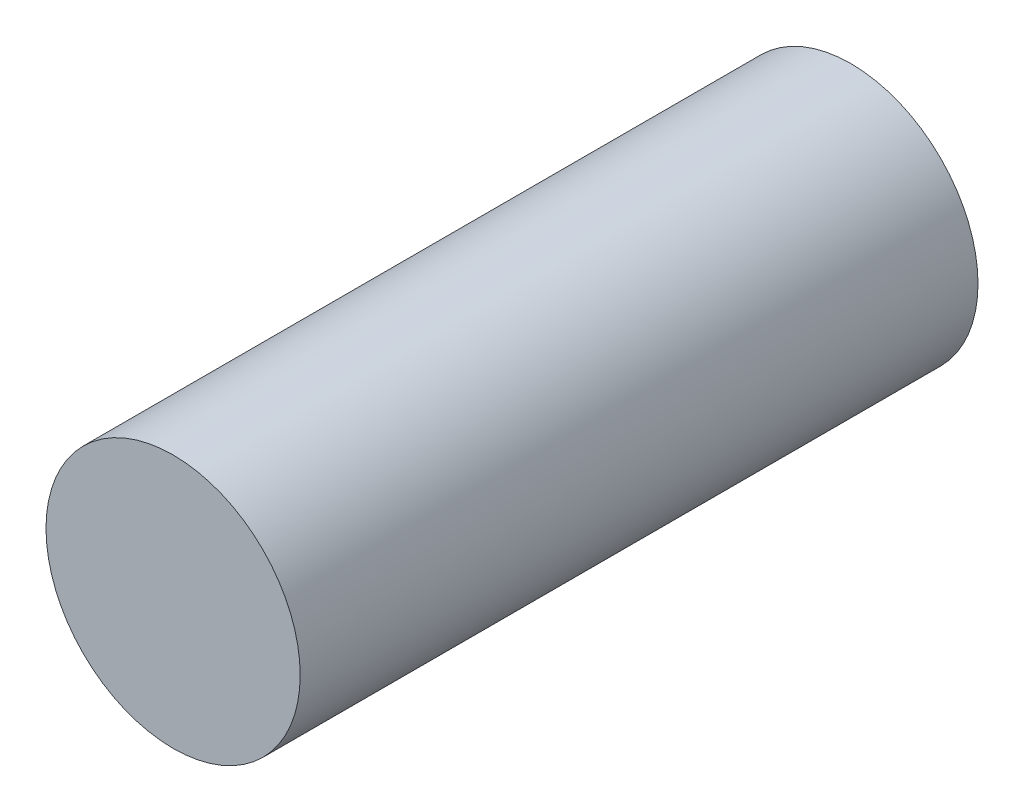
ISO-10303-21;
HEADER;
FILE_DESCRIPTION(('STEP AP214'),'2;1');
FILE_NAME('part.step','',(''),(''),'','','');
FILE_SCHEMA(('AUTOMOTIVE_DESIGN { 1 0 10303 214 1 1 1 1 }'));
ENDSEC;
DATA;
#1=APPLICATION_CONTEXT('core data for automotive mechanical design processes');
#2=APPLICATION_PROTOCOL_DEFINITION('international standard','automotive_design',2000,#1);
#3=PRODUCT_CONTEXT('',#1,'mechanical');
#4=PRODUCT('Part','Part','',(#3));
#5=PRODUCT_RELATED_PRODUCT_CATEGORY('part','',(#4));
#6=PRODUCT_DEFINITION_FORMATION('','',#4);
#7=PRODUCT_DEFINITION_CONTEXT('part definition',#1,'design');
#8=PRODUCT_DEFINITION('design','',#6,#7);
#9=PRODUCT_DEFINITION_SHAPE('','',#8);
#10=(LENGTH_UNIT() NAMED_UNIT(*) SI_UNIT(.MILLI.,.METRE.));
#11=(NAMED_UNIT(*) PLANE_ANGLE_UNIT() SI_UNIT($,.RADIAN.));
#12=(NAMED_UNIT(*) SI_UNIT($,.STERADIAN.) SOLID_ANGLE_UNIT());
#13=UNCERTAINTY_MEASURE_WITH_UNIT(LENGTH_MEASURE(1.E-05),#10,'distance_accuracy_value','');
#14=(GEOMETRIC_REPRESENTATION_CONTEXT(3) GLOBAL_UNCERTAINTY_ASSIGNED_CONTEXT((#13)) GLOBAL_UNIT_ASSIGNED_CONTEXT((#10,
#11,#12)) REPRESENTATION_CONTEXT('',''));
#15=CARTESIAN_POINT('',(0.,0.,0.));
#16=DIRECTION('',(0.,0.,1.));
#17=DIRECTION('',(1.,0.,0.));
#18=AXIS2_PLACEMENT_3D('',#15,#16,#17);
#19=CARTESIAN_POINT('',(0.,0.,6.35));
#20=DIRECTION('',(0.,0.,-0.999999999999998));
#21=DIRECTION('',(-1.,0.,0.));
#22=AXIS2_PLACEMENT_3D('',#19,#20,#21);
#23=CYLINDRICAL_SURFACE('',#22,2.38125);
#24=CARTESIAN_POINT('',(0.,0.,6.35));
#25=DIRECTION('',(0.,0.,0.999999999999998));
#26=DIRECTION('',(1.,0.,0.));
#27=AXIS2_PLACEMENT_3D('',#24,#25,#26);
#28=CIRCLE('',#27,2.38125);
#29=CARTESIAN_POINT('',(-2.38124999999999,0.,6.35));
#30=VERTEX_POINT('',#29);
#31=EDGE_CURVE('E10',#30,#30,#28,.T.);
#32=CARTESIAN_POINT('',(0.,0.,-6.34999999999999));
#33=DIRECTION('',(0.,0.,0.999999999999998));
#34=DIRECTION('',(1.,0.,0.));
#35=AXIS2_PLACEMENT_3D('',#32,#33,#34);
#36=CIRCLE('',#35,2.38125);
#37=CARTESIAN_POINT('',(-2.38124999999999,0.,-6.34999999999998));
#38=VERTEX_POINT('',#37);
#39=EDGE_CURVE('E39',#38,#38,#36,.T.);
#40=CARTESIAN_POINT('',(-2.38124999999999,0.,6.35));
#41=CARTESIAN_POINT('',(-2.38124999999999,0.,6.21770833333333));
#42=CARTESIAN_POINT('',(-2.38124999999999,0.,6.08541666666666));
#43=CARTESIAN_POINT('',(-2.38124999999999,0.,5.82083333333333));
#44=CARTESIAN_POINT('',(-2.38124999999999,0.,5.68854166666666));
#45=CARTESIAN_POINT('',(-2.38124999999999,0.,5.42395833333333));
#46=CARTESIAN_POINT('',(-2.38124999999999,0.,5.29166666666667));
#47=CARTESIAN_POINT('',(-2.38124999999999,0.,5.02708333333333));
#48=CARTESIAN_POINT('',(-2.38124999999999,0.,4.89479166666667));
#49=CARTESIAN_POINT('',(-2.38124999999999,0.,4.63020833333333));
#50=CARTESIAN_POINT('',(-2.38124999999999,0.,4.49791666666667));
#51=CARTESIAN_POINT('',(-2.38124999999999,0.,4.23333333333333));
#52=CARTESIAN_POINT('',(-2.38124999999999,0.,4.10104166666667));
#53=CARTESIAN_POINT('',(-2.38124999999999,0.,3.83645833333333));
#54=CARTESIAN_POINT('',(-2.38124999999999,0.,3.70416666666667));
#55=CARTESIAN_POINT('',(-2.38124999999999,0.,3.43958333333333));
#56=CARTESIAN_POINT('',(-2.38124999999999,0.,3.30729166666667));
#57=CARTESIAN_POINT('',(-2.38124999999999,0.,3.04270833333334));
#58=CARTESIAN_POINT('',(-2.38124999999999,0.,2.91041666666667));
#59=CARTESIAN_POINT('',(-2.38124999999999,0.,2.64583333333334));
#60=CARTESIAN_POINT('',(-2.38124999999999,0.,2.51354166666667));
#61=CARTESIAN_POINT('',(-2.38124999999999,0.,2.24895833333334));
#62=CARTESIAN_POINT('',(-2.38124999999999,0.,2.11666666666667));
#63=CARTESIAN_POINT('',(-2.38124999999999,0.,1.85208333333334));
#64=CARTESIAN_POINT('',(-2.38124999999999,0.,1.71979166666667));
#65=CARTESIAN_POINT('',(-2.38124999999999,0.,1.45520833333334));
#66=CARTESIAN_POINT('',(-2.38124999999999,0.,1.32291666666667));
#67=CARTESIAN_POINT('',(-2.38124999999999,0.,1.05833333333334));
#68=CARTESIAN_POINT('',(-2.38124999999999,0.,0.926041666666671));
#69=CARTESIAN_POINT('',(-2.38124999999999,0.,0.661458333333338));
#70=CARTESIAN_POINT('',(-2.38124999999999,0.,0.529166666666671));
#71=CARTESIAN_POINT('',(-2.38124999999999,0.,0.264583333333339));
#72=CARTESIAN_POINT('',(-2.38124999999999,0.,0.132291666666672));
#73=CARTESIAN_POINT('',(-2.38124999999999,0.,-0.13229166666666));
#74=CARTESIAN_POINT('',(-2.38124999999999,0.,-0.264583333333326));
#75=CARTESIAN_POINT('',(-2.38124999999999,0.,-0.529166666666659));
#76=CARTESIAN_POINT('',(-2.38124999999999,0.,-0.661458333333326));
#77=CARTESIAN_POINT('',(-2.38124999999999,0.,-0.926041666666659));
#78=CARTESIAN_POINT('',(-2.38124999999999,0.,-1.05833333333333));
#79=CARTESIAN_POINT('',(-2.38124999999999,0.,-1.32291666666666));
#80=CARTESIAN_POINT('',(-2.38124999999999,0.,-1.45520833333333));
#81=CARTESIAN_POINT('',(-2.38124999999999,0.,-1.71979166666666));
#82=CARTESIAN_POINT('',(-2.38124999999999,0.,-1.85208333333332));
#83=CARTESIAN_POINT('',(-2.38124999999999,0.,-2.11666666666666));
#84=CARTESIAN_POINT('',(-2.38124999999999,0.,-2.24895833333332));
#85=CARTESIAN_POINT('',(-2.38124999999999,0.,-2.51354166666666));
#86=CARTESIAN_POINT('',(-2.38124999999999,0.,-2.64583333333332));
#87=CARTESIAN_POINT('',(-2.38124999999999,0.,-2.91041666666666));
#88=CARTESIAN_POINT('',(-2.38124999999999,0.,-3.04270833333332));
#89=CARTESIAN_POINT('',(-2.38124999999999,0.,-3.30729166666665));
#90=CARTESIAN_POINT('',(-2.38124999999999,0.,-3.43958333333332));
#91=CARTESIAN_POINT('',(-2.38124999999999,0.,-3.70416666666665));
#92=CARTESIAN_POINT('',(-2.38124999999999,0.,-3.83645833333332));
#93=CARTESIAN_POINT('',(-2.38124999999999,0.,-4.10104166666665));
#94=CARTESIAN_POINT('',(-2.38124999999999,0.,-4.23333333333332));
#95=CARTESIAN_POINT('',(-2.38124999999999,0.,-4.49791666666665));
#96=CARTESIAN_POINT('',(-2.38124999999999,0.,-4.63020833333332));
#97=CARTESIAN_POINT('',(-2.38124999999999,0.,-4.89479166666665));
#98=CARTESIAN_POINT('',(-2.38124999999999,0.,-5.02708333333332));
#99=CARTESIAN_POINT('',(-2.38124999999999,0.,-5.29166666666665));
#100=CARTESIAN_POINT('',(-2.38124999999999,0.,-5.42395833333332));
#101=CARTESIAN_POINT('',(-2.38124999999999,0.,-5.68854166666665));
#102=CARTESIAN_POINT('',(-2.38124999999999,0.,-5.82083333333332));
#103=CARTESIAN_POINT('',(-2.38124999999999,0.,-6.08541666666665));
#104=CARTESIAN_POINT('',(-2.38124999999999,0.,-6.21770833333332));
#105=CARTESIAN_POINT('',(-2.38124999999999,0.,-6.34999999999998));
#106=B_SPLINE_CURVE_WITH_KNOTS('',3,(#40,#41,#42,#43,#44,#45,#46,#47,#48,#49,#50,#51,#52,#53,
#54,#55,#56,#57,#58,#59,#60,#61,#62,#63,#64,#65,#66,#67,#68,#69,#70,#71,#72,#73,#74,#75,#76,#77,
#78,#79,#80,#81,#82,#83,#84,#85,#86,#87,#88,#89,#90,#91,#92,#93,#94,#95,#96,#97,#98,#99,#100,
#101,#102,#103,#104,#105),.UNSPECIFIED.,.F.,.F.,(4,2,2,2,2,2,2,2,2,2,2,2,2,2,2,2,2,2,2,2,2,2,2,
2,2,2,2,2,2,2,2,2,4),(0.,0.396874999999999,0.793749999999998,1.190625,1.5875,1.984375,2.38125,
2.778125,3.17499999999999,3.57187499999999,3.96874999999999,4.36562499999999,4.76249999999999,
5.15937499999999,5.55624999999999,5.95312499999999,6.34999999999999,6.74687499999999,
7.14374999999999,7.54062499999999,7.93749999999999,8.33437499999999,8.73124999999999,
9.12812499999999,9.52499999999998,9.92187499999998,10.31875,10.715625,11.1125,11.509375,
11.90625,12.303125,12.7),.UNSPECIFIED.);
#107=EDGE_CURVE('BSEAM36',#30,#38,#106,.T.);
#108=ORIENTED_EDGE('',*,*,#31,.F.);
#109=ORIENTED_EDGE('',*,*,#39,.T.);
#110=ORIENTED_EDGE('',*,*,#107,.T.);
#111=ORIENTED_EDGE('',*,*,#107,.F.);
#112=EDGE_LOOP('',(#108,#110,#109,#111));
#113=FACE_BOUND('',#112,.T.);
#114=ADVANCED_FACE('F36',(#113),#23,.T.);
#115=CARTESIAN_POINT('',(0.,0.,6.35));
#116=DIRECTION('',(0.,0.,0.999999999999998));
#117=DIRECTION('',(1.,0.,0.));
#118=AXIS2_PLACEMENT_3D('',#115,#116,#117);
#119=PLANE('',#118);
#120=ORIENTED_EDGE('',*,*,#31,.T.);
#121=EDGE_LOOP('',(#120));
#122=FACE_BOUND('',#121,.T.);
#123=ADVANCED_FACE('F55',(#122),#119,.T.);
#124=CARTESIAN_POINT('',(0.,0.,-6.34999999999999));
#125=DIRECTION('',(0.,0.,0.999999999999998));
#126=DIRECTION('',(1.,0.,0.));
#127=AXIS2_PLACEMENT_3D('',#124,#125,#126);
#128=PLANE('',#127);
#129=ORIENTED_EDGE('',*,*,#39,.F.);
#130=EDGE_LOOP('',(#129));
#131=FACE_BOUND('',#130,.T.);
#132=ADVANCED_FACE('F53',(#131),#128,.F.);
#133=CLOSED_SHELL('',(#114,#123,#132));
#134=MANIFOLD_SOLID_BREP('B2',#133);
#135=ADVANCED_BREP_SHAPE_REPRESENTATION('',(#18,#134),#14);
#136=SHAPE_DEFINITION_REPRESENTATION(#9,#135);
ENDSEC;
END-ISO-10303-21;
